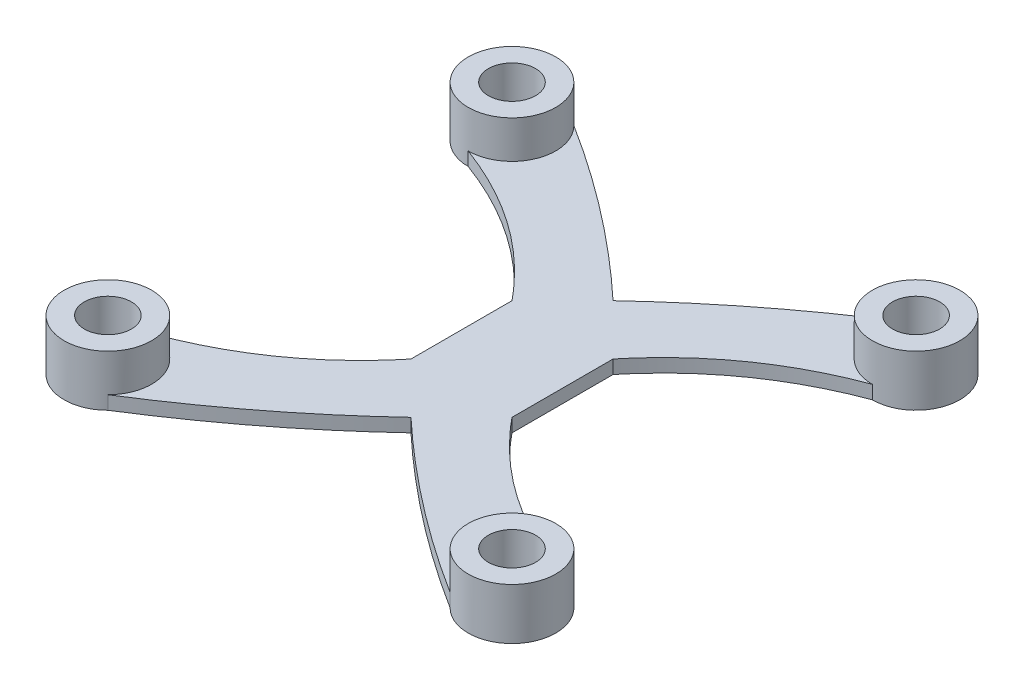
ISO-10303-21;
HEADER;
FILE_DESCRIPTION(('STEP AP214'),'2;1');
FILE_NAME('part.step','',(''),(''),'','','');
FILE_SCHEMA(('AUTOMOTIVE_DESIGN { 1 0 10303 214 1 1 1 1 }'));
ENDSEC;
DATA;
#1=APPLICATION_CONTEXT('core data for automotive mechanical design processes');
#2=APPLICATION_PROTOCOL_DEFINITION('international standard','automotive_design',2000,#1);
#3=PRODUCT_CONTEXT('',#1,'mechanical');
#4=PRODUCT('Part','Part','',(#3));
#5=PRODUCT_RELATED_PRODUCT_CATEGORY('part','',(#4));
#6=PRODUCT_DEFINITION_FORMATION('','',#4);
#7=PRODUCT_DEFINITION_CONTEXT('part definition',#1,'design');
#8=PRODUCT_DEFINITION('design','',#6,#7);
#9=PRODUCT_DEFINITION_SHAPE('','',#8);
#10=(LENGTH_UNIT() NAMED_UNIT(*) SI_UNIT(.MILLI.,.METRE.));
#11=(NAMED_UNIT(*) PLANE_ANGLE_UNIT() SI_UNIT($,.RADIAN.));
#12=(NAMED_UNIT(*) SI_UNIT($,.STERADIAN.) SOLID_ANGLE_UNIT());
#13=UNCERTAINTY_MEASURE_WITH_UNIT(LENGTH_MEASURE(1.E-05),#10,'distance_accuracy_value','');
#14=(GEOMETRIC_REPRESENTATION_CONTEXT(3) GLOBAL_UNCERTAINTY_ASSIGNED_CONTEXT((#13)) GLOBAL_UNIT_ASSIGNED_CONTEXT((#10,
#11,#12)) REPRESENTATION_CONTEXT('',''));
#15=CARTESIAN_POINT('',(0.,0.,0.));
#16=DIRECTION('',(0.,0.,1.));
#17=DIRECTION('',(1.,0.,0.));
#18=AXIS2_PLACEMENT_3D('',#15,#16,#17);
#19=CARTESIAN_POINT('',(0.,1.,0.));
#20=DIRECTION('',(0.,1.,0.));
#21=DIRECTION('',(0.,0.,1.));
#22=AXIS2_PLACEMENT_3D('',#19,#20,#21);
#23=PLANE('',#22);
#24=CARTESIAN_POINT('',(-15.,1.,11.75));
#25=CARTESIAN_POINT('',(-8.24080163232304,1.,9.24049933684202));
#26=CARTESIAN_POINT('',(-3.75,1.,3.75));
#27=B_SPLINE_CURVE_WITH_KNOTS('',2,(#24,#25,#26),.UNSPECIFIED.,.F.,.F.,(3,3),(0.,1.),.UNSPECIFIED.);
#28=CARTESIAN_POINT('',(-15.,1.,11.75));
#29=VERTEX_POINT('',#28);
#30=CARTESIAN_POINT('',(-3.75,1.,3.75));
#31=VERTEX_POINT('',#30);
#32=EDGE_CURVE('E161',#29,#31,#27,.T.);
#33=ORIENTED_EDGE('',*,*,#32,.F.);
#34=CARTESIAN_POINT('',(-15.,1.,15.));
#35=DIRECTION('',(0.,1.,0.));
#36=DIRECTION('',(0.,0.,-1.));
#37=AXIS2_PLACEMENT_3D('',#34,#35,#36);
#38=CIRCLE('',#37,3.25);
#39=CARTESIAN_POINT('',(-12.7019029611437,1.,17.2980970388563));
#40=VERTEX_POINT('',#39);
#41=EDGE_CURVE('E55',#40,#29,#38,.T.);
#42=ORIENTED_EDGE('',*,*,#41,.F.);
#43=CARTESIAN_POINT('',(-12.7019029611437,1.,17.2980970388563));
#44=CARTESIAN_POINT('',(-3.57208065136352,1.,11.5520674876467));
#45=CARTESIAN_POINT('',(3.75,1.,3.75));
#46=B_SPLINE_CURVE_WITH_KNOTS('',2,(#43,#44,#45),.UNSPECIFIED.,.F.,.F.,(3,3),(0.,1.),.UNSPECIFIED.);
#47=CARTESIAN_POINT('',(0.,1.,7.5));
#48=VERTEX_POINT('',#47);
#49=EDGE_CURVE('E115',#40,#48,#46,.T.);
#50=ORIENTED_EDGE('',*,*,#49,.T.);
#51=CARTESIAN_POINT('',(12.7019029611437,1.,17.2980970388563));
#52=CARTESIAN_POINT('',(3.57208065136352,1.,11.5520674876467));
#53=CARTESIAN_POINT('',(-3.75,1.,3.75));
#54=B_SPLINE_CURVE_WITH_KNOTS('',2,(#51,#52,#53),.UNSPECIFIED.,.F.,.F.,(3,3),(0.,1.),.UNSPECIFIED.);
#55=CARTESIAN_POINT('',(12.7019029611437,1.,17.2980970388563));
#56=VERTEX_POINT('',#55);
#57=EDGE_CURVE('E248',#56,#48,#54,.T.);
#58=ORIENTED_EDGE('',*,*,#57,.F.);
#59=CARTESIAN_POINT('',(15.,1.,15.));
#60=DIRECTION('',(0.,1.,0.));
#61=DIRECTION('',(0.,0.,1.));
#62=AXIS2_PLACEMENT_3D('',#59,#60,#61);
#63=CIRCLE('',#62,3.25);
#64=CARTESIAN_POINT('',(15.,1.,11.75));
#65=VERTEX_POINT('',#64);
#66=EDGE_CURVE('E306',#65,#56,#63,.T.);
#67=ORIENTED_EDGE('',*,*,#66,.F.);
#68=CARTESIAN_POINT('',(15.,1.,11.75));
#69=CARTESIAN_POINT('',(8.24080163232304,1.,9.24049933684202));
#70=CARTESIAN_POINT('',(3.75,1.,3.75));
#71=B_SPLINE_CURVE_WITH_KNOTS('',2,(#68,#69,#70),.UNSPECIFIED.,.F.,.F.,(3,3),(0.,1.),.UNSPECIFIED.);
#72=CARTESIAN_POINT('',(3.75,1.,3.75));
#73=VERTEX_POINT('',#72);
#74=EDGE_CURVE('E243',#65,#73,#71,.T.);
#75=ORIENTED_EDGE('',*,*,#74,.T.);
#76=DIRECTION('',(0.,0.,1.));
#77=VECTOR('',#76,1.);
#78=CARTESIAN_POINT('',(3.75,1.,0.));
#79=LINE('',#78,#77);
#80=CARTESIAN_POINT('',(3.75,1.,-3.75));
#81=VERTEX_POINT('',#80);
#82=EDGE_CURVE('E222',#81,#73,#79,.T.);
#83=ORIENTED_EDGE('',*,*,#82,.F.);
#84=CARTESIAN_POINT('',(15.,1.,-11.75));
#85=CARTESIAN_POINT('',(8.24080163232304,1.,-9.24049933684202));
#86=CARTESIAN_POINT('',(3.75,1.,-3.75));
#87=B_SPLINE_CURVE_WITH_KNOTS('',2,(#84,#85,#86),.UNSPECIFIED.,.F.,.F.,(3,3),(0.,1.),.UNSPECIFIED.);
#88=CARTESIAN_POINT('',(15.,1.,-11.75));
#89=VERTEX_POINT('',#88);
#90=EDGE_CURVE('E213',#89,#81,#87,.T.);
#91=ORIENTED_EDGE('',*,*,#90,.F.);
#92=CARTESIAN_POINT('',(15.,1.,-15.));
#93=DIRECTION('',(0.,1.,0.));
#94=DIRECTION('',(0.,0.,-1.));
#95=AXIS2_PLACEMENT_3D('',#92,#93,#94);
#96=CIRCLE('',#95,3.25);
#97=CARTESIAN_POINT('',(12.7019029611437,1.,-17.2980970388563));
#98=VERTEX_POINT('',#97);
#99=EDGE_CURVE('E320',#98,#89,#96,.T.);
#100=ORIENTED_EDGE('',*,*,#99,.F.);
#101=CARTESIAN_POINT('',(12.7019029611437,1.,-17.2980970388563));
#102=CARTESIAN_POINT('',(3.57208065136352,1.,-11.5520674876467));
#103=CARTESIAN_POINT('',(-3.75,1.,-3.75));
#104=B_SPLINE_CURVE_WITH_KNOTS('',2,(#101,#102,#103),.UNSPECIFIED.,.F.,.F.,(3,3),(0.,1.),.UNSPECIFIED.);
#105=CARTESIAN_POINT('',(0.,1.,-7.5));
#106=VERTEX_POINT('',#105);
#107=EDGE_CURVE('E204',#98,#106,#104,.T.);
#108=ORIENTED_EDGE('',*,*,#107,.T.);
#109=CARTESIAN_POINT('',(-12.7019029611437,1.,-17.2980970388563));
#110=CARTESIAN_POINT('',(-3.57208065136351,1.,-11.5520674876467));
#111=CARTESIAN_POINT('',(3.75,1.,-3.75));
#112=B_SPLINE_CURVE_WITH_KNOTS('',2,(#109,#110,#111),.UNSPECIFIED.,.F.,.F.,(3,3),(0.,1.),.UNSPECIFIED.);
#113=CARTESIAN_POINT('',(-12.7019029611437,1.,-17.2980970388563));
#114=VERTEX_POINT('',#113);
#115=EDGE_CURVE('E39',#114,#106,#112,.T.);
#116=ORIENTED_EDGE('',*,*,#115,.F.);
#117=CARTESIAN_POINT('',(-15.,1.,-15.));
#118=DIRECTION('',(0.,1.,0.));
#119=DIRECTION('',(0.,0.,1.));
#120=AXIS2_PLACEMENT_3D('',#117,#118,#119);
#121=CIRCLE('',#120,3.25);
#122=CARTESIAN_POINT('',(-15.,1.,-11.75));
#123=VERTEX_POINT('',#122);
#124=EDGE_CURVE('E146',#123,#114,#121,.T.);
#125=ORIENTED_EDGE('',*,*,#124,.F.);
#126=CARTESIAN_POINT('',(-15.,1.,-11.75));
#127=CARTESIAN_POINT('',(-8.24080163232304,1.,-9.24049933684202));
#128=CARTESIAN_POINT('',(-3.75,1.,-3.75));
#129=B_SPLINE_CURVE_WITH_KNOTS('',2,(#126,#127,#128),.UNSPECIFIED.,.F.,.F.,(3,3),(0.,1.),.UNSPECIFIED.);
#130=CARTESIAN_POINT('',(-3.75,1.,-3.75));
#131=VERTEX_POINT('',#130);
#132=EDGE_CURVE('E139',#123,#131,#129,.T.);
#133=ORIENTED_EDGE('',*,*,#132,.T.);
#134=DIRECTION('',(0.,0.,1.));
#135=VECTOR('',#134,1.);
#136=CARTESIAN_POINT('',(-3.75,1.,0.));
#137=LINE('',#136,#135);
#138=EDGE_CURVE('E143',#131,#31,#137,.T.);
#139=ORIENTED_EDGE('',*,*,#138,.T.);
#140=EDGE_LOOP('',(#33,#42,#50,#58,#67,#75,#83,#91,#100,#108,#116,#125,#133,#139));
#141=FACE_BOUND('',#140,.T.);
#142=ADVANCED_FACE('F35',(#141),#23,.T.);
#143=CARTESIAN_POINT('',(-15.,1.,15.));
#144=DIRECTION('',(0.,-1.,0.));
#145=DIRECTION('',(0.,0.,-1.));
#146=AXIS2_PLACEMENT_3D('',#143,#144,#145);
#147=CYLINDRICAL_SURFACE('',#146,3.25);
#148=CARTESIAN_POINT('',(-15.,0.,15.));
#149=DIRECTION('',(0.,1.,0.));
#150=DIRECTION('',(0.,0.,1.));
#151=AXIS2_PLACEMENT_3D('',#148,#149,#150);
#152=CIRCLE('',#151,3.25);
#153=CARTESIAN_POINT('',(-12.7019029611437,0.,17.2980970388563));
#154=VERTEX_POINT('',#153);
#155=CARTESIAN_POINT('',(-15.,0.,11.75));
#156=VERTEX_POINT('',#155);
#157=EDGE_CURVE('E172',#154,#156,#152,.F.);
#158=ORIENTED_EDGE('',*,*,#157,.F.);
#159=DIRECTION('',(0.,-1.,0.));
#160=VECTOR('',#159,1.);
#161=CARTESIAN_POINT('',(-12.7019029611437,1.,17.2980970388563));
#162=LINE('',#161,#160);
#163=EDGE_CURVE('E12',#40,#154,#162,.T.);
#164=ORIENTED_EDGE('',*,*,#163,.F.);
#165=ORIENTED_EDGE('',*,*,#41,.T.);
#166=DIRECTION('',(0.,-1.,0.));
#167=VECTOR('',#166,1.);
#168=CARTESIAN_POINT('',(-15.,1.,11.75));
#169=LINE('',#168,#167);
#170=EDGE_CURVE('E107',#29,#156,#169,.T.);
#171=ORIENTED_EDGE('',*,*,#170,.T.);
#172=EDGE_LOOP('',(#158,#164,#165,#171));
#173=FACE_BOUND('',#172,.T.);
#174=CARTESIAN_POINT('',(-15.,3.8,15.));
#175=DIRECTION('',(0.,1.,0.));
#176=DIRECTION('',(0.,0.,1.));
#177=AXIS2_PLACEMENT_3D('',#174,#175,#176);
#178=CIRCLE('',#177,3.25);
#179=CARTESIAN_POINT('',(-15.,3.8,18.25));
#180=VERTEX_POINT('',#179);
#181=EDGE_CURVE('E307',#180,#180,#178,.T.);
#182=ORIENTED_EDGE('',*,*,#181,.F.);
#183=EDGE_LOOP('',(#182));
#184=FACE_BOUND('',#183,.T.);
#185=ADVANCED_FACE('F37',(#173,#184),#147,.T.);
#186=DIRECTION('',(0.,-1.,0.));
#187=VECTOR('',#186,1.);
#188=SURFACE_OF_LINEAR_EXTRUSION('',#46,#187);
#189=CARTESIAN_POINT('',(-12.7019029611437,0.,17.2980970388563));
#190=CARTESIAN_POINT('',(-3.57208065136352,0.,11.5520674876467));
#191=CARTESIAN_POINT('',(3.75,0.,3.75));
#192=B_SPLINE_CURVE_WITH_KNOTS('',2,(#189,#190,#191),.UNSPECIFIED.,.F.,.F.,(3,3),(0.,1.),.UNSPECIFIED.);
#193=CARTESIAN_POINT('',(0.,0.,7.5));
#194=VERTEX_POINT('',#193);
#195=EDGE_CURVE('E363',#154,#194,#192,.T.);
#196=ORIENTED_EDGE('',*,*,#195,.T.);
#197=DIRECTION('',(0.,-1.,0.));
#198=VECTOR('',#197,1.);
#199=CARTESIAN_POINT('',(0.,1.,7.5));
#200=LINE('',#199,#198);
#201=EDGE_CURVE('E46',#48,#194,#200,.T.);
#202=ORIENTED_EDGE('',*,*,#201,.F.);
#203=ORIENTED_EDGE('',*,*,#49,.F.);
#204=ORIENTED_EDGE('',*,*,#163,.T.);
#205=EDGE_LOOP('',(#196,#202,#203,#204));
#206=FACE_BOUND('',#205,.T.);
#207=ADVANCED_FACE('F266',(#206),#188,.F.);
#208=DIRECTION('',(0.,-1.,0.));
#209=VECTOR('',#208,1.);
#210=SURFACE_OF_LINEAR_EXTRUSION('',#54,#209);
#211=CARTESIAN_POINT('',(12.7019029611437,0.,17.2980970388563));
#212=CARTESIAN_POINT('',(3.57208065136352,0.,11.5520674876467));
#213=CARTESIAN_POINT('',(-3.75,0.,3.75));
#214=B_SPLINE_CURVE_WITH_KNOTS('',2,(#211,#212,#213),.UNSPECIFIED.,.F.,.F.,(3,3),(0.,1.),.UNSPECIFIED.);
#215=CARTESIAN_POINT('',(12.7019029611437,0.,17.2980970388563));
#216=VERTEX_POINT('',#215);
#217=EDGE_CURVE('E361',#216,#194,#214,.T.);
#218=ORIENTED_EDGE('',*,*,#217,.F.);
#219=DIRECTION('',(0.,-1.,0.));
#220=VECTOR('',#219,1.);
#221=CARTESIAN_POINT('',(12.7019029611437,1.,17.2980970388563));
#222=LINE('',#221,#220);
#223=EDGE_CURVE('E358',#56,#216,#222,.T.);
#224=ORIENTED_EDGE('',*,*,#223,.F.);
#225=ORIENTED_EDGE('',*,*,#57,.T.);
#226=ORIENTED_EDGE('',*,*,#201,.T.);
#227=EDGE_LOOP('',(#218,#224,#225,#226));
#228=FACE_BOUND('',#227,.T.);
#229=ADVANCED_FACE('F264',(#228),#210,.T.);
#230=CARTESIAN_POINT('',(15.,1.,15.));
#231=DIRECTION('',(0.,-1.,0.));
#232=DIRECTION('',(0.,0.,-1.));
#233=AXIS2_PLACEMENT_3D('',#230,#231,#232);
#234=CYLINDRICAL_SURFACE('',#233,3.25);
#235=CARTESIAN_POINT('',(15.,0.,15.));
#236=DIRECTION('',(0.,1.,0.));
#237=DIRECTION('',(0.,0.,1.));
#238=AXIS2_PLACEMENT_3D('',#235,#236,#237);
#239=CIRCLE('',#238,3.25);
#240=CARTESIAN_POINT('',(15.,0.,11.75));
#241=VERTEX_POINT('',#240);
#242=EDGE_CURVE('E367',#216,#241,#239,.T.);
#243=ORIENTED_EDGE('',*,*,#242,.T.);
#244=DIRECTION('',(0.,-1.,0.));
#245=VECTOR('',#244,1.);
#246=CARTESIAN_POINT('',(15.,1.,11.75));
#247=LINE('',#246,#245);
#248=EDGE_CURVE('E355',#65,#241,#247,.T.);
#249=ORIENTED_EDGE('',*,*,#248,.F.);
#250=ORIENTED_EDGE('',*,*,#66,.T.);
#251=ORIENTED_EDGE('',*,*,#223,.T.);
#252=EDGE_LOOP('',(#243,#249,#250,#251));
#253=FACE_BOUND('',#252,.T.);
#254=CARTESIAN_POINT('',(15.,3.8,15.));
#255=DIRECTION('',(0.,1.,0.));
#256=DIRECTION('',(0.,0.,1.));
#257=AXIS2_PLACEMENT_3D('',#254,#255,#256);
#258=CIRCLE('',#257,3.25);
#259=CARTESIAN_POINT('',(15.,3.8,18.25));
#260=VERTEX_POINT('',#259);
#261=EDGE_CURVE('E310',#260,#260,#258,.T.);
#262=ORIENTED_EDGE('',*,*,#261,.F.);
#263=EDGE_LOOP('',(#262));
#264=FACE_BOUND('',#263,.T.);
#265=ADVANCED_FACE('F240',(#253,#264),#234,.T.);
#266=DIRECTION('',(0.,-1.,0.));
#267=VECTOR('',#266,1.);
#268=SURFACE_OF_LINEAR_EXTRUSION('',#71,#267);
#269=CARTESIAN_POINT('',(15.,0.,11.75));
#270=CARTESIAN_POINT('',(8.24080163232304,0.,9.24049933684202));
#271=CARTESIAN_POINT('',(3.75,0.,3.75));
#272=B_SPLINE_CURVE_WITH_KNOTS('',2,(#269,#270,#271),.UNSPECIFIED.,.F.,.F.,(3,3),(0.,1.),.UNSPECIFIED.);
#273=CARTESIAN_POINT('',(3.75,0.,3.75));
#274=VERTEX_POINT('',#273);
#275=EDGE_CURVE('E369',#241,#274,#272,.T.);
#276=ORIENTED_EDGE('',*,*,#275,.T.);
#277=DIRECTION('',(0.,-1.,0.));
#278=VECTOR('',#277,1.);
#279=CARTESIAN_POINT('',(3.75,1.,3.75));
#280=LINE('',#279,#278);
#281=EDGE_CURVE('E353',#73,#274,#280,.T.);
#282=ORIENTED_EDGE('',*,*,#281,.F.);
#283=ORIENTED_EDGE('',*,*,#74,.F.);
#284=ORIENTED_EDGE('',*,*,#248,.T.);
#285=EDGE_LOOP('',(#276,#282,#283,#284));
#286=FACE_BOUND('',#285,.T.);
#287=ADVANCED_FACE('F236',(#286),#268,.F.);
#288=CARTESIAN_POINT('',(3.75,1.,0.));
#289=DIRECTION('',(1.,0.,0.));
#290=DIRECTION('',(0.,0.,-1.));
#291=AXIS2_PLACEMENT_3D('',#288,#289,#290);
#292=PLANE('',#291);
#293=DIRECTION('',(0.,0.,1.));
#294=VECTOR('',#293,1.);
#295=CARTESIAN_POINT('',(3.75,0.,0.));
#296=LINE('',#295,#294);
#297=CARTESIAN_POINT('',(3.75,0.,-3.75));
#298=VERTEX_POINT('',#297);
#299=EDGE_CURVE('E383',#298,#274,#296,.T.);
#300=ORIENTED_EDGE('',*,*,#299,.F.);
#301=DIRECTION('',(0.,-1.,0.));
#302=VECTOR('',#301,1.);
#303=CARTESIAN_POINT('',(3.75,1.,-3.75));
#304=LINE('',#303,#302);
#305=EDGE_CURVE('E351',#81,#298,#304,.T.);
#306=ORIENTED_EDGE('',*,*,#305,.F.);
#307=ORIENTED_EDGE('',*,*,#82,.T.);
#308=ORIENTED_EDGE('',*,*,#281,.T.);
#309=EDGE_LOOP('',(#300,#306,#307,#308));
#310=FACE_BOUND('',#309,.T.);
#311=ADVANCED_FACE('F232',(#310),#292,.T.);
#312=DIRECTION('',(0.,-1.,0.));
#313=VECTOR('',#312,1.);
#314=SURFACE_OF_LINEAR_EXTRUSION('',#87,#313);
#315=CARTESIAN_POINT('',(15.,0.,-11.75));
#316=CARTESIAN_POINT('',(8.24080163232304,0.,-9.24049933684202));
#317=CARTESIAN_POINT('',(3.75,0.,-3.75));
#318=B_SPLINE_CURVE_WITH_KNOTS('',2,(#315,#316,#317),.UNSPECIFIED.,.F.,.F.,(3,3),(0.,1.),.UNSPECIFIED.);
#319=CARTESIAN_POINT('',(15.,0.,-11.75));
#320=VERTEX_POINT('',#319);
#321=EDGE_CURVE('E389',#320,#298,#318,.T.);
#322=ORIENTED_EDGE('',*,*,#321,.F.);
#323=DIRECTION('',(0.,-1.,0.));
#324=VECTOR('',#323,1.);
#325=CARTESIAN_POINT('',(15.,1.,-11.75));
#326=LINE('',#325,#324);
#327=EDGE_CURVE('E346',#89,#320,#326,.T.);
#328=ORIENTED_EDGE('',*,*,#327,.F.);
#329=ORIENTED_EDGE('',*,*,#90,.T.);
#330=ORIENTED_EDGE('',*,*,#305,.T.);
#331=EDGE_LOOP('',(#322,#328,#329,#330));
#332=FACE_BOUND('',#331,.T.);
#333=ADVANCED_FACE('F228',(#332),#314,.T.);
#334=CARTESIAN_POINT('',(15.,1.,-15.));
#335=DIRECTION('',(0.,-1.,0.));
#336=DIRECTION('',(0.,0.,-1.));
#337=AXIS2_PLACEMENT_3D('',#334,#335,#336);
#338=CYLINDRICAL_SURFACE('',#337,3.25);
#339=CARTESIAN_POINT('',(15.,0.,-15.));
#340=DIRECTION('',(0.,1.,0.));
#341=DIRECTION('',(0.,0.,1.));
#342=AXIS2_PLACEMENT_3D('',#339,#340,#341);
#343=CIRCLE('',#342,3.25);
#344=CARTESIAN_POINT('',(12.7019029611437,0.,-17.2980970388563));
#345=VERTEX_POINT('',#344);
#346=EDGE_CURVE('E394',#345,#320,#343,.F.);
#347=ORIENTED_EDGE('',*,*,#346,.F.);
#348=DIRECTION('',(0.,-1.,0.));
#349=VECTOR('',#348,1.);
#350=CARTESIAN_POINT('',(12.7019029611437,1.,-17.2980970388563));
#351=LINE('',#350,#349);
#352=EDGE_CURVE('E340',#98,#345,#351,.T.);
#353=ORIENTED_EDGE('',*,*,#352,.F.);
#354=ORIENTED_EDGE('',*,*,#99,.T.);
#355=ORIENTED_EDGE('',*,*,#327,.T.);
#356=EDGE_LOOP('',(#347,#353,#354,#355));
#357=FACE_BOUND('',#356,.T.);
#358=CARTESIAN_POINT('',(15.,3.8,-15.));
#359=DIRECTION('',(0.,1.,0.));
#360=DIRECTION('',(0.,0.,1.));
#361=AXIS2_PLACEMENT_3D('',#358,#359,#360);
#362=CIRCLE('',#361,3.25);
#363=CARTESIAN_POINT('',(15.,3.8,-11.75));
#364=VERTEX_POINT('',#363);
#365=EDGE_CURVE('E316',#364,#364,#362,.T.);
#366=ORIENTED_EDGE('',*,*,#365,.F.);
#367=EDGE_LOOP('',(#366));
#368=FACE_BOUND('',#367,.T.);
#369=ADVANCED_FACE('F231',(#357,#368),#338,.T.);
#370=DIRECTION('',(0.,-1.,0.));
#371=VECTOR('',#370,1.);
#372=SURFACE_OF_LINEAR_EXTRUSION('',#104,#371);
#373=CARTESIAN_POINT('',(12.7019029611437,0.,-17.2980970388563));
#374=CARTESIAN_POINT('',(3.57208065136352,0.,-11.5520674876467));
#375=CARTESIAN_POINT('',(-3.75,0.,-3.75));
#376=B_SPLINE_CURVE_WITH_KNOTS('',2,(#373,#374,#375),.UNSPECIFIED.,.F.,.F.,(3,3),(0.,1.),.UNSPECIFIED.);
#377=CARTESIAN_POINT('',(0.,0.,-7.5));
#378=VERTEX_POINT('',#377);
#379=EDGE_CURVE('E400',#345,#378,#376,.T.);
#380=ORIENTED_EDGE('',*,*,#379,.T.);
#381=DIRECTION('',(0.,-1.,0.));
#382=VECTOR('',#381,1.);
#383=CARTESIAN_POINT('',(0.,1.,-7.5));
#384=LINE('',#383,#382);
#385=EDGE_CURVE('E337',#106,#378,#384,.T.);
#386=ORIENTED_EDGE('',*,*,#385,.F.);
#387=ORIENTED_EDGE('',*,*,#107,.F.);
#388=ORIENTED_EDGE('',*,*,#352,.T.);
#389=EDGE_LOOP('',(#380,#386,#387,#388));
#390=FACE_BOUND('',#389,.T.);
#391=ADVANCED_FACE('F197',(#390),#372,.F.);
#392=DIRECTION('',(0.,-1.,0.));
#393=VECTOR('',#392,1.);
#394=SURFACE_OF_LINEAR_EXTRUSION('',#112,#393);
#395=CARTESIAN_POINT('',(-12.7019029611437,0.,-17.2980970388563));
#396=CARTESIAN_POINT('',(-3.57208065136351,0.,-11.5520674876467));
#397=CARTESIAN_POINT('',(3.75,0.,-3.75));
#398=B_SPLINE_CURVE_WITH_KNOTS('',2,(#395,#396,#397),.UNSPECIFIED.,.F.,.F.,(3,3),(0.,1.),.UNSPECIFIED.);
#399=CARTESIAN_POINT('',(-12.7019029611437,0.,-17.2980970388563));
#400=VERTEX_POINT('',#399);
#401=EDGE_CURVE('E404',#400,#378,#398,.T.);
#402=ORIENTED_EDGE('',*,*,#401,.F.);
#403=DIRECTION('',(0.,-1.,0.));
#404=VECTOR('',#403,1.);
#405=CARTESIAN_POINT('',(-12.7019029611437,1.,-17.2980970388563));
#406=LINE('',#405,#404);
#407=EDGE_CURVE('E334',#114,#400,#406,.T.);
#408=ORIENTED_EDGE('',*,*,#407,.F.);
#409=ORIENTED_EDGE('',*,*,#115,.T.);
#410=ORIENTED_EDGE('',*,*,#385,.T.);
#411=EDGE_LOOP('',(#402,#408,#409,#410));
#412=FACE_BOUND('',#411,.T.);
#413=ADVANCED_FACE('F193',(#412),#394,.T.);
#414=CARTESIAN_POINT('',(-15.,1.,-15.));
#415=DIRECTION('',(0.,-1.,0.));
#416=DIRECTION('',(0.,0.,-1.));
#417=AXIS2_PLACEMENT_3D('',#414,#415,#416);
#418=CYLINDRICAL_SURFACE('',#417,3.25);
#419=CARTESIAN_POINT('',(-15.,0.,-15.));
#420=DIRECTION('',(0.,1.,0.));
#421=DIRECTION('',(0.,0.,1.));
#422=AXIS2_PLACEMENT_3D('',#419,#420,#421);
#423=CIRCLE('',#422,3.25);
#424=CARTESIAN_POINT('',(-15.,0.,-11.75));
#425=VERTEX_POINT('',#424);
#426=EDGE_CURVE('E412',#400,#425,#423,.T.);
#427=ORIENTED_EDGE('',*,*,#426,.T.);
#428=DIRECTION('',(0.,-1.,0.));
#429=VECTOR('',#428,1.);
#430=CARTESIAN_POINT('',(-15.,1.,-11.75));
#431=LINE('',#430,#429);
#432=EDGE_CURVE('E158',#123,#425,#431,.T.);
#433=ORIENTED_EDGE('',*,*,#432,.F.);
#434=ORIENTED_EDGE('',*,*,#124,.T.);
#435=ORIENTED_EDGE('',*,*,#407,.T.);
#436=EDGE_LOOP('',(#427,#433,#434,#435));
#437=FACE_BOUND('',#436,.T.);
#438=CARTESIAN_POINT('',(-15.,3.8,-15.));
#439=DIRECTION('',(0.,1.,0.));
#440=DIRECTION('',(0.,0.,1.));
#441=AXIS2_PLACEMENT_3D('',#438,#439,#440);
#442=CIRCLE('',#441,3.25);
#443=CARTESIAN_POINT('',(-15.,3.8,-11.75));
#444=VERTEX_POINT('',#443);
#445=EDGE_CURVE('E325',#444,#444,#442,.T.);
#446=ORIENTED_EDGE('',*,*,#445,.F.);
#447=EDGE_LOOP('',(#446));
#448=FACE_BOUND('',#447,.T.);
#449=ADVANCED_FACE('F190',(#437,#448),#418,.T.);
#450=DIRECTION('',(0.,-1.,0.));
#451=VECTOR('',#450,1.);
#452=SURFACE_OF_LINEAR_EXTRUSION('',#129,#451);
#453=CARTESIAN_POINT('',(-15.,0.,-11.75));
#454=CARTESIAN_POINT('',(-8.24080163232304,0.,-9.24049933684202));
#455=CARTESIAN_POINT('',(-3.75,0.,-3.75));
#456=B_SPLINE_CURVE_WITH_KNOTS('',2,(#453,#454,#455),.UNSPECIFIED.,.F.,.F.,(3,3),(0.,1.),.UNSPECIFIED.);
#457=CARTESIAN_POINT('',(-3.75,0.,-3.75));
#458=VERTEX_POINT('',#457);
#459=EDGE_CURVE('E155',#425,#458,#456,.T.);
#460=ORIENTED_EDGE('',*,*,#459,.T.);
#461=DIRECTION('',(0.,-1.,0.));
#462=VECTOR('',#461,1.);
#463=CARTESIAN_POINT('',(-3.75,1.,-3.75));
#464=LINE('',#463,#462);
#465=EDGE_CURVE('E152',#131,#458,#464,.T.);
#466=ORIENTED_EDGE('',*,*,#465,.F.);
#467=ORIENTED_EDGE('',*,*,#132,.F.);
#468=ORIENTED_EDGE('',*,*,#432,.T.);
#469=EDGE_LOOP('',(#460,#466,#467,#468));
#470=FACE_BOUND('',#469,.T.);
#471=ADVANCED_FACE('F153',(#470),#452,.F.);
#472=CARTESIAN_POINT('',(-3.75,1.,0.));
#473=DIRECTION('',(1.,0.,0.));
#474=DIRECTION('',(0.,0.,-1.));
#475=AXIS2_PLACEMENT_3D('',#472,#473,#474);
#476=PLANE('',#475);
#477=DIRECTION('',(0.,0.,1.));
#478=VECTOR('',#477,1.);
#479=CARTESIAN_POINT('',(-3.75,0.,0.));
#480=LINE('',#479,#478);
#481=CARTESIAN_POINT('',(-3.75,0.,3.75));
#482=VERTEX_POINT('',#481);
#483=EDGE_CURVE('E420',#458,#482,#480,.T.);
#484=ORIENTED_EDGE('',*,*,#483,.T.);
#485=DIRECTION('',(0.,-1.,0.));
#486=VECTOR('',#485,1.);
#487=CARTESIAN_POINT('',(-3.75,1.,3.75));
#488=LINE('',#487,#486);
#489=EDGE_CURVE('E103',#31,#482,#488,.T.);
#490=ORIENTED_EDGE('',*,*,#489,.F.);
#491=ORIENTED_EDGE('',*,*,#138,.F.);
#492=ORIENTED_EDGE('',*,*,#465,.T.);
#493=EDGE_LOOP('',(#484,#490,#491,#492));
#494=FACE_BOUND('',#493,.T.);
#495=ADVANCED_FACE('F160',(#494),#476,.F.);
#496=CARTESIAN_POINT('',(-15.,1.,-15.));
#497=DIRECTION('',(0.,-1.,0.));
#498=DIRECTION('',(0.,0.,-1.));
#499=AXIS2_PLACEMENT_3D('',#496,#497,#498);
#500=CYLINDRICAL_SURFACE('',#499,1.75);
#501=CARTESIAN_POINT('',(-15.,0.,-15.));
#502=DIRECTION('',(0.,1.,0.));
#503=DIRECTION('',(0.,0.,1.));
#504=AXIS2_PLACEMENT_3D('',#501,#502,#503);
#505=CIRCLE('',#504,1.75);
#506=CARTESIAN_POINT('',(-15.,0.,-13.25));
#507=VERTEX_POINT('',#506);
#508=EDGE_CURVE('E437',#507,#507,#505,.T.);
#509=ORIENTED_EDGE('',*,*,#508,.F.);
#510=EDGE_LOOP('',(#509));
#511=FACE_BOUND('',#510,.T.);
#512=CARTESIAN_POINT('',(-15.,3.8,-15.));
#513=DIRECTION('',(0.,1.,0.));
#514=DIRECTION('',(0.,0.,1.));
#515=AXIS2_PLACEMENT_3D('',#512,#513,#514);
#516=CIRCLE('',#515,1.75);
#517=CARTESIAN_POINT('',(-15.,3.8,-13.25));
#518=VERTEX_POINT('',#517);
#519=EDGE_CURVE('E319',#518,#518,#516,.T.);
#520=ORIENTED_EDGE('',*,*,#519,.T.);
#521=EDGE_LOOP('',(#520));
#522=FACE_BOUND('',#521,.T.);
#523=ADVANCED_FACE('F187',(#511,#522),#500,.F.);
#524=CARTESIAN_POINT('',(15.,1.,15.));
#525=DIRECTION('',(0.,-1.,0.));
#526=DIRECTION('',(0.,0.,-1.));
#527=AXIS2_PLACEMENT_3D('',#524,#525,#526);
#528=CYLINDRICAL_SURFACE('',#527,1.75);
#529=CARTESIAN_POINT('',(15.,0.,15.));
#530=DIRECTION('',(0.,1.,0.));
#531=DIRECTION('',(0.,0.,1.));
#532=AXIS2_PLACEMENT_3D('',#529,#530,#531);
#533=CIRCLE('',#532,1.75);
#534=CARTESIAN_POINT('',(15.,0.,16.75));
#535=VERTEX_POINT('',#534);
#536=EDGE_CURVE('E301',#535,#535,#533,.T.);
#537=ORIENTED_EDGE('',*,*,#536,.F.);
#538=EDGE_LOOP('',(#537));
#539=FACE_BOUND('',#538,.T.);
#540=CARTESIAN_POINT('',(15.,3.8,15.));
#541=DIRECTION('',(0.,1.,0.));
#542=DIRECTION('',(0.,0.,1.));
#543=AXIS2_PLACEMENT_3D('',#540,#541,#542);
#544=CIRCLE('',#543,1.74999999999999);
#545=CARTESIAN_POINT('',(15.,3.8,16.75));
#546=VERTEX_POINT('',#545);
#547=EDGE_CURVE('E304',#546,#546,#544,.T.);
#548=ORIENTED_EDGE('',*,*,#547,.T.);
#549=EDGE_LOOP('',(#548));
#550=FACE_BOUND('',#549,.T.);
#551=ADVANCED_FACE('F290',(#539,#550),#528,.F.);
#552=CARTESIAN_POINT('',(-15.,1.,15.));
#553=DIRECTION('',(0.,-1.,0.));
#554=DIRECTION('',(0.,0.,-1.));
#555=AXIS2_PLACEMENT_3D('',#552,#553,#554);
#556=CYLINDRICAL_SURFACE('',#555,1.75);
#557=CARTESIAN_POINT('',(-15.,0.,15.));
#558=DIRECTION('',(0.,1.,0.));
#559=DIRECTION('',(0.,0.,1.));
#560=AXIS2_PLACEMENT_3D('',#557,#558,#559);
#561=CIRCLE('',#560,1.75);
#562=CARTESIAN_POINT('',(-15.,0.,16.75));
#563=VERTEX_POINT('',#562);
#564=EDGE_CURVE('E430',#563,#563,#561,.F.);
#565=ORIENTED_EDGE('',*,*,#564,.T.);
#566=EDGE_LOOP('',(#565));
#567=FACE_BOUND('',#566,.T.);
#568=CARTESIAN_POINT('',(-15.,3.8,15.));
#569=DIRECTION('',(0.,1.,0.));
#570=DIRECTION('',(0.,0.,1.));
#571=AXIS2_PLACEMENT_3D('',#568,#569,#570);
#572=CIRCLE('',#571,1.75);
#573=CARTESIAN_POINT('',(-15.,3.8,16.75));
#574=VERTEX_POINT('',#573);
#575=EDGE_CURVE('E482',#574,#574,#572,.T.);
#576=ORIENTED_EDGE('',*,*,#575,.T.);
#577=EDGE_LOOP('',(#576));
#578=FACE_BOUND('',#577,.T.);
#579=ADVANCED_FACE('F183',(#567,#578),#556,.F.);
#580=DIRECTION('',(0.,-1.,0.));
#581=VECTOR('',#580,1.);
#582=SURFACE_OF_LINEAR_EXTRUSION('',#27,#581);
#583=CARTESIAN_POINT('',(-15.,0.,11.75));
#584=CARTESIAN_POINT('',(-8.24080163232304,0.,9.24049933684202));
#585=CARTESIAN_POINT('',(-3.75,0.,3.75));
#586=B_SPLINE_CURVE_WITH_KNOTS('',2,(#583,#584,#585),.UNSPECIFIED.,.F.,.F.,(3,3),(0.,1.),.UNSPECIFIED.);
#587=EDGE_CURVE('E425',#156,#482,#586,.T.);
#588=ORIENTED_EDGE('',*,*,#587,.F.);
#589=ORIENTED_EDGE('',*,*,#170,.F.);
#590=ORIENTED_EDGE('',*,*,#32,.T.);
#591=ORIENTED_EDGE('',*,*,#489,.T.);
#592=EDGE_LOOP('',(#588,#589,#590,#591));
#593=FACE_BOUND('',#592,.T.);
#594=ADVANCED_FACE('F178',(#593),#582,.T.);
#595=CARTESIAN_POINT('',(15.,1.,-15.));
#596=DIRECTION('',(0.,-1.,0.));
#597=DIRECTION('',(0.,0.,-1.));
#598=AXIS2_PLACEMENT_3D('',#595,#596,#597);
#599=CYLINDRICAL_SURFACE('',#598,1.75);
#600=CARTESIAN_POINT('',(15.,0.,-15.));
#601=DIRECTION('',(0.,1.,0.));
#602=DIRECTION('',(0.,0.,1.));
#603=AXIS2_PLACEMENT_3D('',#600,#601,#602);
#604=CIRCLE('',#603,1.75);
#605=CARTESIAN_POINT('',(15.,0.,-13.25));
#606=VERTEX_POINT('',#605);
#607=EDGE_CURVE('E440',#606,#606,#604,.F.);
#608=ORIENTED_EDGE('',*,*,#607,.T.);
#609=EDGE_LOOP('',(#608));
#610=FACE_BOUND('',#609,.T.);
#611=CARTESIAN_POINT('',(15.,3.8,-15.));
#612=DIRECTION('',(0.,1.,0.));
#613=DIRECTION('',(0.,0.,1.));
#614=AXIS2_PLACEMENT_3D('',#611,#612,#613);
#615=CIRCLE('',#614,1.75);
#616=CARTESIAN_POINT('',(15.,3.8,-13.25));
#617=VERTEX_POINT('',#616);
#618=EDGE_CURVE('E322',#617,#617,#615,.T.);
#619=ORIENTED_EDGE('',*,*,#618,.T.);
#620=EDGE_LOOP('',(#619));
#621=FACE_BOUND('',#620,.T.);
#622=ADVANCED_FACE('F182',(#610,#621),#599,.F.);
#623=CARTESIAN_POINT('',(0.,0.,0.));
#624=DIRECTION('',(0.,1.,0.));
#625=DIRECTION('',(0.,0.,1.));
#626=AXIS2_PLACEMENT_3D('',#623,#624,#625);
#627=PLANE('',#626);
#628=ORIENTED_EDGE('',*,*,#157,.T.);
#629=ORIENTED_EDGE('',*,*,#587,.T.);
#630=ORIENTED_EDGE('',*,*,#483,.F.);
#631=ORIENTED_EDGE('',*,*,#459,.F.);
#632=ORIENTED_EDGE('',*,*,#426,.F.);
#633=ORIENTED_EDGE('',*,*,#401,.T.);
#634=ORIENTED_EDGE('',*,*,#379,.F.);
#635=ORIENTED_EDGE('',*,*,#346,.T.);
#636=ORIENTED_EDGE('',*,*,#321,.T.);
#637=ORIENTED_EDGE('',*,*,#299,.T.);
#638=ORIENTED_EDGE('',*,*,#275,.F.);
#639=ORIENTED_EDGE('',*,*,#242,.F.);
#640=ORIENTED_EDGE('',*,*,#217,.T.);
#641=ORIENTED_EDGE('',*,*,#195,.F.);
#642=EDGE_LOOP('',(#628,#629,#630,#631,#632,#633,#634,#635,#636,#637,#638,#639,#640,#641));
#643=FACE_BOUND('',#642,.T.);
#644=ORIENTED_EDGE('',*,*,#564,.F.);
#645=EDGE_LOOP('',(#644));
#646=FACE_BOUND('',#645,.T.);
#647=ORIENTED_EDGE('',*,*,#536,.T.);
#648=EDGE_LOOP('',(#647));
#649=FACE_BOUND('',#648,.T.);
#650=ORIENTED_EDGE('',*,*,#508,.T.);
#651=EDGE_LOOP('',(#650));
#652=FACE_BOUND('',#651,.T.);
#653=ORIENTED_EDGE('',*,*,#607,.F.);
#654=EDGE_LOOP('',(#653));
#655=FACE_BOUND('',#654,.T.);
#656=ADVANCED_FACE('F282',(#643,#646,#649,#652,#655),#627,.F.);
#657=CARTESIAN_POINT('',(0.,3.8,0.));
#658=DIRECTION('',(0.,1.,0.));
#659=DIRECTION('',(0.,0.,1.));
#660=AXIS2_PLACEMENT_3D('',#657,#658,#659);
#661=PLANE('',#660);
#662=ORIENTED_EDGE('',*,*,#519,.F.);
#663=EDGE_LOOP('',(#662));
#664=FACE_BOUND('',#663,.T.);
#665=ORIENTED_EDGE('',*,*,#445,.T.);
#666=EDGE_LOOP('',(#665));
#667=FACE_BOUND('',#666,.T.);
#668=ADVANCED_FACE('F280',(#664,#667),#661,.T.);
#669=CARTESIAN_POINT('',(0.,3.8,0.));
#670=DIRECTION('',(0.,1.,0.));
#671=DIRECTION('',(0.,0.,1.));
#672=AXIS2_PLACEMENT_3D('',#669,#670,#671);
#673=PLANE('',#672);
#674=ORIENTED_EDGE('',*,*,#618,.F.);
#675=EDGE_LOOP('',(#674));
#676=FACE_BOUND('',#675,.T.);
#677=ORIENTED_EDGE('',*,*,#365,.T.);
#678=EDGE_LOOP('',(#677));
#679=FACE_BOUND('',#678,.T.);
#680=ADVANCED_FACE('F448',(#676,#679),#673,.T.);
#681=CARTESIAN_POINT('',(0.,3.8,0.));
#682=DIRECTION('',(0.,1.,0.));
#683=DIRECTION('',(0.,0.,1.));
#684=AXIS2_PLACEMENT_3D('',#681,#682,#683);
#685=PLANE('',#684);
#686=ORIENTED_EDGE('',*,*,#547,.F.);
#687=EDGE_LOOP('',(#686));
#688=FACE_BOUND('',#687,.T.);
#689=ORIENTED_EDGE('',*,*,#261,.T.);
#690=EDGE_LOOP('',(#689));
#691=FACE_BOUND('',#690,.T.);
#692=ADVANCED_FACE('F451',(#688,#691),#685,.T.);
#693=CARTESIAN_POINT('',(0.,3.8,0.));
#694=DIRECTION('',(0.,1.,0.));
#695=DIRECTION('',(0.,0.,1.));
#696=AXIS2_PLACEMENT_3D('',#693,#694,#695);
#697=PLANE('',#696);
#698=ORIENTED_EDGE('',*,*,#575,.F.);
#699=EDGE_LOOP('',(#698));
#700=FACE_BOUND('',#699,.T.);
#701=ORIENTED_EDGE('',*,*,#181,.T.);
#702=EDGE_LOOP('',(#701));
#703=FACE_BOUND('',#702,.T.);
#704=ADVANCED_FACE('F507',(#700,#703),#697,.T.);
#705=CLOSED_SHELL('',(#142,#185,#207,#229,#265,#287,#311,#333,#369,#391,#413,#449,#471,#495,
#523,#551,#579,#594,#622,#656,#668,#680,#692,#704));
#706=MANIFOLD_SOLID_BREP('B2',#705);
#707=ADVANCED_BREP_SHAPE_REPRESENTATION('',(#18,#706),#14);
#708=SHAPE_DEFINITION_REPRESENTATION(#9,#707);
ENDSEC;
END-ISO-10303-21;
